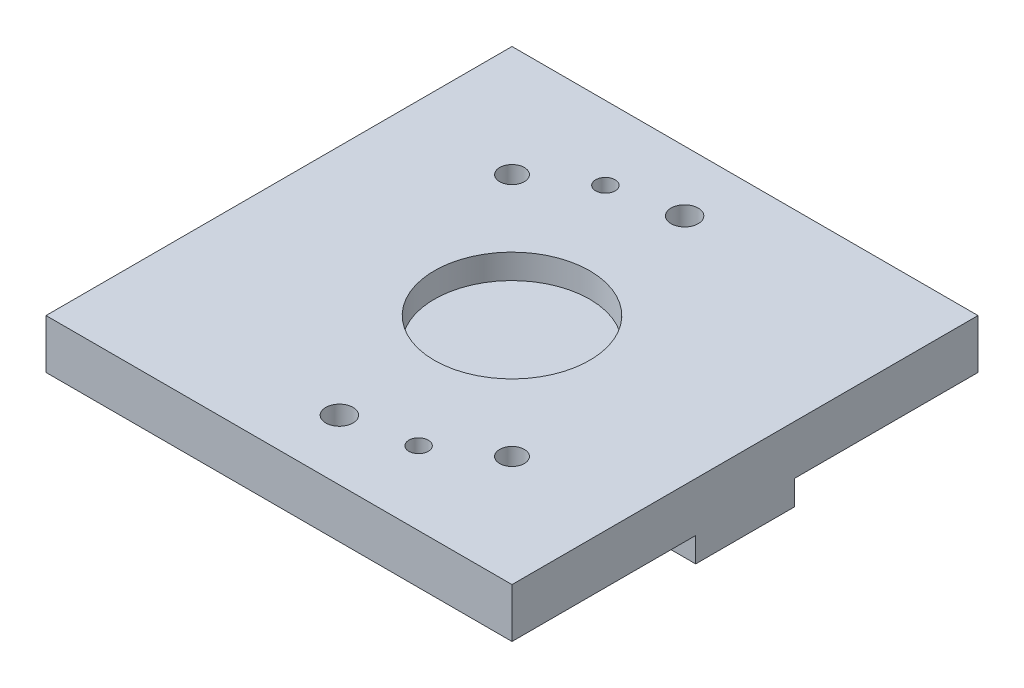
ISO-10303-21;
HEADER;
FILE_DESCRIPTION(('STEP AP214'),'2;1');
FILE_NAME('part.step','',(''),(''),'','','');
FILE_SCHEMA(('AUTOMOTIVE_DESIGN { 1 0 10303 214 1 1 1 1 }'));
ENDSEC;
DATA;
#1=APPLICATION_CONTEXT('core data for automotive mechanical design processes');
#2=APPLICATION_PROTOCOL_DEFINITION('international standard','automotive_design',2000,#1);
#3=PRODUCT_CONTEXT('',#1,'mechanical');
#4=PRODUCT('Part','Part','',(#3));
#5=PRODUCT_RELATED_PRODUCT_CATEGORY('part','',(#4));
#6=PRODUCT_DEFINITION_FORMATION('','',#4);
#7=PRODUCT_DEFINITION_CONTEXT('part definition',#1,'design');
#8=PRODUCT_DEFINITION('design','',#6,#7);
#9=PRODUCT_DEFINITION_SHAPE('','',#8);
#10=(LENGTH_UNIT() NAMED_UNIT(*) SI_UNIT(.MILLI.,.METRE.));
#11=(NAMED_UNIT(*) PLANE_ANGLE_UNIT() SI_UNIT($,.RADIAN.));
#12=(NAMED_UNIT(*) SI_UNIT($,.STERADIAN.) SOLID_ANGLE_UNIT());
#13=UNCERTAINTY_MEASURE_WITH_UNIT(LENGTH_MEASURE(1.E-05),#10,'distance_accuracy_value','');
#14=(GEOMETRIC_REPRESENTATION_CONTEXT(3) GLOBAL_UNCERTAINTY_ASSIGNED_CONTEXT((#13)) GLOBAL_UNIT_ASSIGNED_CONTEXT((#10,
#11,#12)) REPRESENTATION_CONTEXT('',''));
#15=CARTESIAN_POINT('',(0.,0.,0.));
#16=DIRECTION('',(0.,0.,1.));
#17=DIRECTION('',(1.,0.,0.));
#18=AXIS2_PLACEMENT_3D('',#15,#16,#17);
#19=CARTESIAN_POINT('',(0.,0.,0.));
#20=DIRECTION('',(0.,-1.,0.));
#21=DIRECTION('',(0.,0.,-1.));
#22=AXIS2_PLACEMENT_3D('',#19,#20,#21);
#23=PLANE('',#22);
#24=CARTESIAN_POINT('',(-17.0102785686281,0.,-41.066445220126));
#25=DIRECTION('',(0.,-1.,0.));
#26=DIRECTION('',(0.,0.,-1.));
#27=AXIS2_PLACEMENT_3D('',#24,#25,#26);
#28=CIRCLE('',#27,2.5);
#29=CARTESIAN_POINT('',(-17.0102785686281,0.,-43.566445220126));
#30=VERTEX_POINT('',#29);
#31=EDGE_CURVE('E205',#30,#30,#28,.T.);
#32=ORIENTED_EDGE('',*,*,#31,.F.);
#33=EDGE_LOOP('',(#32));
#34=FACE_BOUND('',#33,.T.);
#35=CARTESIAN_POINT('',(0.,0.,-44.45));
#36=DIRECTION('',(0.,-1.,0.));
#37=DIRECTION('',(0.,0.,-1.));
#38=AXIS2_PLACEMENT_3D('',#35,#36,#37);
#39=CIRCLE('',#38,3.5);
#40=CARTESIAN_POINT('',(0.,0.,-47.95));
#41=VERTEX_POINT('',#40);
#42=EDGE_CURVE('E193',#41,#41,#39,.T.);
#43=ORIENTED_EDGE('',*,*,#42,.F.);
#44=EDGE_LOOP('',(#43));
#45=FACE_BOUND('',#44,.T.);
#46=CARTESIAN_POINT('',(-31.4308964237415,0.,-31.4308964237407));
#47=DIRECTION('',(0.,-1.,0.));
#48=DIRECTION('',(0.,0.,-1.));
#49=AXIS2_PLACEMENT_3D('',#46,#47,#48);
#50=CIRCLE('',#49,3.17499999999999);
#51=CARTESIAN_POINT('',(-31.4308964237415,0.,-34.6058964237407));
#52=VERTEX_POINT('',#51);
#53=EDGE_CURVE('E181',#52,#52,#50,.T.);
#54=ORIENTED_EDGE('',*,*,#53,.F.);
#55=EDGE_LOOP('',(#54));
#56=FACE_BOUND('',#55,.T.);
#57=DIRECTION('',(1.,0.,0.));
#58=VECTOR('',#57,1.);
#59=CARTESIAN_POINT('',(-60.,0.,-12.7));
#60=LINE('',#59,#58);
#61=CARTESIAN_POINT('',(-60.,0.,-12.7));
#62=VERTEX_POINT('',#61);
#63=CARTESIAN_POINT('',(60.,0.,-12.7));
#64=VERTEX_POINT('',#63);
#65=EDGE_CURVE('E54',#62,#64,#60,.T.);
#66=ORIENTED_EDGE('',*,*,#65,.F.);
#67=DIRECTION('',(0.,0.,1.));
#68=VECTOR('',#67,1.);
#69=CARTESIAN_POINT('',(-60.,0.,60.));
#70=LINE('',#69,#68);
#71=CARTESIAN_POINT('',(-60.,0.,-60.));
#72=VERTEX_POINT('',#71);
#73=EDGE_CURVE('E148',#72,#62,#70,.T.);
#74=ORIENTED_EDGE('',*,*,#73,.F.);
#75=DIRECTION('',(-1.,0.,0.));
#76=VECTOR('',#75,1.);
#77=CARTESIAN_POINT('',(-60.,0.,-60.));
#78=LINE('',#77,#76);
#79=CARTESIAN_POINT('',(60.,0.,-60.));
#80=VERTEX_POINT('',#79);
#81=EDGE_CURVE('E145',#80,#72,#78,.T.);
#82=ORIENTED_EDGE('',*,*,#81,.F.);
#83=DIRECTION('',(0.,0.,-1.));
#84=VECTOR('',#83,1.);
#85=CARTESIAN_POINT('',(60.,0.,60.));
#86=LINE('',#85,#84);
#87=EDGE_CURVE('E59',#64,#80,#86,.T.);
#88=ORIENTED_EDGE('',*,*,#87,.F.);
#89=EDGE_LOOP('',(#66,#74,#82,#88));
#90=FACE_BOUND('',#89,.T.);
#91=ADVANCED_FACE('F39',(#34,#45,#56,#90),#23,.T.);
#92=CARTESIAN_POINT('',(60.,12.7,60.));
#93=DIRECTION('',(-1.,0.,0.));
#94=DIRECTION('',(0.,0.,1.));
#95=AXIS2_PLACEMENT_3D('',#92,#93,#94);
#96=PLANE('',#95);
#97=CARTESIAN_POINT('',(60.,0.,60.));
#98=VERTEX_POINT('',#97);
#99=CARTESIAN_POINT('',(60.,0.,12.7));
#100=VERTEX_POINT('',#99);
#101=EDGE_CURVE('E127',#98,#100,#86,.T.);
#102=ORIENTED_EDGE('',*,*,#101,.T.);
#103=DIRECTION('',(0.,1.,0.));
#104=VECTOR('',#103,1.);
#105=CARTESIAN_POINT('',(60.,-6.35,12.7));
#106=LINE('',#105,#104);
#107=CARTESIAN_POINT('',(60.,-6.35,12.7));
#108=VERTEX_POINT('',#107);
#109=EDGE_CURVE('E108',#108,#100,#106,.T.);
#110=ORIENTED_EDGE('',*,*,#109,.F.);
#111=DIRECTION('',(0.,0.,1.));
#112=VECTOR('',#111,1.);
#113=CARTESIAN_POINT('',(60.,-6.35,-12.7));
#114=LINE('',#113,#112);
#115=CARTESIAN_POINT('',(60.,-6.35,-12.7));
#116=VERTEX_POINT('',#115);
#117=EDGE_CURVE('E114',#116,#108,#114,.T.);
#118=ORIENTED_EDGE('',*,*,#117,.F.);
#119=DIRECTION('',(0.,1.,0.));
#120=VECTOR('',#119,1.);
#121=CARTESIAN_POINT('',(60.,-6.35,-12.7));
#122=LINE('',#121,#120);
#123=EDGE_CURVE('E166',#116,#64,#122,.T.);
#124=ORIENTED_EDGE('',*,*,#123,.T.);
#125=ORIENTED_EDGE('',*,*,#87,.T.);
#126=DIRECTION('',(0.,-1.,0.));
#127=VECTOR('',#126,1.);
#128=CARTESIAN_POINT('',(60.,12.7,-60.));
#129=LINE('',#128,#127);
#130=CARTESIAN_POINT('',(60.,12.7,-60.));
#131=VERTEX_POINT('',#130);
#132=EDGE_CURVE('E11',#131,#80,#129,.T.);
#133=ORIENTED_EDGE('',*,*,#132,.F.);
#134=DIRECTION('',(0.,0.,-1.));
#135=VECTOR('',#134,1.);
#136=CARTESIAN_POINT('',(60.,12.7,60.));
#137=LINE('',#136,#135);
#138=CARTESIAN_POINT('',(60.,12.7,60.));
#139=VERTEX_POINT('',#138);
#140=EDGE_CURVE('E134',#139,#131,#137,.T.);
#141=ORIENTED_EDGE('',*,*,#140,.F.);
#142=DIRECTION('',(0.,-1.,0.));
#143=VECTOR('',#142,1.);
#144=CARTESIAN_POINT('',(60.,12.7,60.));
#145=LINE('',#144,#143);
#146=EDGE_CURVE('E143',#139,#98,#145,.T.);
#147=ORIENTED_EDGE('',*,*,#146,.T.);
#148=EDGE_LOOP('',(#102,#110,#118,#124,#125,#133,#141,#147));
#149=FACE_BOUND('',#148,.T.);
#150=ADVANCED_FACE('F41',(#149),#96,.F.);
#151=CARTESIAN_POINT('',(-60.,12.7,-60.));
#152=DIRECTION('',(0.,0.,1.));
#153=DIRECTION('',(1.,0.,0.));
#154=AXIS2_PLACEMENT_3D('',#151,#152,#153);
#155=PLANE('',#154);
#156=ORIENTED_EDGE('',*,*,#81,.T.);
#157=DIRECTION('',(0.,-1.,0.));
#158=VECTOR('',#157,1.);
#159=CARTESIAN_POINT('',(-60.,12.7,-60.));
#160=LINE('',#159,#158);
#161=CARTESIAN_POINT('',(-60.,12.7,-60.));
#162=VERTEX_POINT('',#161);
#163=EDGE_CURVE('E47',#162,#72,#160,.T.);
#164=ORIENTED_EDGE('',*,*,#163,.F.);
#165=DIRECTION('',(-1.,0.,0.));
#166=VECTOR('',#165,1.);
#167=CARTESIAN_POINT('',(-60.,12.7,-60.));
#168=LINE('',#167,#166);
#169=EDGE_CURVE('E137',#131,#162,#168,.T.);
#170=ORIENTED_EDGE('',*,*,#169,.F.);
#171=ORIENTED_EDGE('',*,*,#132,.T.);
#172=EDGE_LOOP('',(#156,#164,#170,#171));
#173=FACE_BOUND('',#172,.T.);
#174=ADVANCED_FACE('F164',(#173),#155,.F.);
#175=CARTESIAN_POINT('',(-60.,12.7,60.));
#176=DIRECTION('',(1.,0.,0.));
#177=DIRECTION('',(0.,0.,-1.));
#178=AXIS2_PLACEMENT_3D('',#175,#176,#177);
#179=PLANE('',#178);
#180=ORIENTED_EDGE('',*,*,#73,.T.);
#181=DIRECTION('',(0.,1.,0.));
#182=VECTOR('',#181,1.);
#183=CARTESIAN_POINT('',(-60.,-6.35,-12.7));
#184=LINE('',#183,#182);
#185=CARTESIAN_POINT('',(-60.,-6.35,-12.7));
#186=VERTEX_POINT('',#185);
#187=EDGE_CURVE('E130',#186,#62,#184,.T.);
#188=ORIENTED_EDGE('',*,*,#187,.F.);
#189=DIRECTION('',(0.,0.,-1.));
#190=VECTOR('',#189,1.);
#191=CARTESIAN_POINT('',(-60.,-6.35,-12.7));
#192=LINE('',#191,#190);
#193=CARTESIAN_POINT('',(-60.,-6.35,12.7));
#194=VERTEX_POINT('',#193);
#195=EDGE_CURVE('E113',#194,#186,#192,.T.);
#196=ORIENTED_EDGE('',*,*,#195,.F.);
#197=DIRECTION('',(0.,1.,0.));
#198=VECTOR('',#197,1.);
#199=CARTESIAN_POINT('',(-60.,-6.35,12.7));
#200=LINE('',#199,#198);
#201=CARTESIAN_POINT('',(-60.,0.,12.7));
#202=VERTEX_POINT('',#201);
#203=EDGE_CURVE('E110',#194,#202,#200,.T.);
#204=ORIENTED_EDGE('',*,*,#203,.T.);
#205=CARTESIAN_POINT('',(-60.,0.,60.));
#206=VERTEX_POINT('',#205);
#207=EDGE_CURVE('E147',#202,#206,#70,.T.);
#208=ORIENTED_EDGE('',*,*,#207,.T.);
#209=DIRECTION('',(0.,-1.,0.));
#210=VECTOR('',#209,1.);
#211=CARTESIAN_POINT('',(-60.,12.7,60.));
#212=LINE('',#211,#210);
#213=CARTESIAN_POINT('',(-60.,12.7,60.));
#214=VERTEX_POINT('',#213);
#215=EDGE_CURVE('E152',#214,#206,#212,.T.);
#216=ORIENTED_EDGE('',*,*,#215,.F.);
#217=DIRECTION('',(0.,0.,1.));
#218=VECTOR('',#217,1.);
#219=CARTESIAN_POINT('',(-60.,12.7,60.));
#220=LINE('',#219,#218);
#221=EDGE_CURVE('E140',#162,#214,#220,.T.);
#222=ORIENTED_EDGE('',*,*,#221,.F.);
#223=ORIENTED_EDGE('',*,*,#163,.T.);
#224=EDGE_LOOP('',(#180,#188,#196,#204,#208,#216,#222,#223));
#225=FACE_BOUND('',#224,.T.);
#226=ADVANCED_FACE('F158',(#225),#179,.F.);
#227=CARTESIAN_POINT('',(-60.,12.7,60.));
#228=DIRECTION('',(0.,0.,-1.));
#229=DIRECTION('',(-1.,0.,0.));
#230=AXIS2_PLACEMENT_3D('',#227,#228,#229);
#231=PLANE('',#230);
#232=DIRECTION('',(1.,0.,0.));
#233=VECTOR('',#232,1.);
#234=CARTESIAN_POINT('',(-60.,0.,60.));
#235=LINE('',#234,#233);
#236=EDGE_CURVE('E138',#206,#98,#235,.T.);
#237=ORIENTED_EDGE('',*,*,#236,.T.);
#238=ORIENTED_EDGE('',*,*,#146,.F.);
#239=DIRECTION('',(1.,0.,0.));
#240=VECTOR('',#239,1.);
#241=CARTESIAN_POINT('',(-60.,12.7,60.));
#242=LINE('',#241,#240);
#243=EDGE_CURVE('E142',#214,#139,#242,.T.);
#244=ORIENTED_EDGE('',*,*,#243,.F.);
#245=ORIENTED_EDGE('',*,*,#215,.T.);
#246=EDGE_LOOP('',(#237,#238,#244,#245));
#247=FACE_BOUND('',#246,.T.);
#248=ADVANCED_FACE('F231',(#247),#231,.F.);
#249=CARTESIAN_POINT('',(0.,12.7,0.));
#250=DIRECTION('',(0.,-1.,0.));
#251=DIRECTION('',(0.,0.,-1.));
#252=AXIS2_PLACEMENT_3D('',#249,#250,#251);
#253=PLANE('',#252);
#254=CARTESIAN_POINT('',(0.,12.7,0.));
#255=DIRECTION('',(0.,1.,0.));
#256=DIRECTION('',(0.,0.,1.));
#257=AXIS2_PLACEMENT_3D('',#254,#255,#256);
#258=CIRCLE('',#257,20.);
#259=CARTESIAN_POINT('',(0.,12.7,20.));
#260=VERTEX_POINT('',#259);
#261=EDGE_CURVE('E212',#260,#260,#258,.T.);
#262=ORIENTED_EDGE('',*,*,#261,.F.);
#263=EDGE_LOOP('',(#262));
#264=FACE_BOUND('',#263,.T.);
#265=CARTESIAN_POINT('',(-17.0102785686281,12.7,-41.066445220126));
#266=DIRECTION('',(0.,1.,0.));
#267=DIRECTION('',(0.,0.,1.));
#268=AXIS2_PLACEMENT_3D('',#265,#266,#267);
#269=CIRCLE('',#268,2.5);
#270=CARTESIAN_POINT('',(-17.0102785686281,12.7,-38.566445220126));
#271=VERTEX_POINT('',#270);
#272=EDGE_CURVE('E208',#271,#271,#269,.T.);
#273=ORIENTED_EDGE('',*,*,#272,.F.);
#274=EDGE_LOOP('',(#273));
#275=FACE_BOUND('',#274,.T.);
#276=CARTESIAN_POINT('',(17.0102785686319,12.7,41.066445220126));
#277=DIRECTION('',(0.,1.,0.));
#278=DIRECTION('',(0.,0.,1.));
#279=AXIS2_PLACEMENT_3D('',#276,#277,#278);
#280=CIRCLE('',#279,2.5);
#281=CARTESIAN_POINT('',(17.0102785686319,12.7,43.566445220126));
#282=VERTEX_POINT('',#281);
#283=EDGE_CURVE('E202',#282,#282,#280,.T.);
#284=ORIENTED_EDGE('',*,*,#283,.F.);
#285=EDGE_LOOP('',(#284));
#286=FACE_BOUND('',#285,.T.);
#287=CARTESIAN_POINT('',(0.,12.7,-44.45));
#288=DIRECTION('',(0.,1.,0.));
#289=DIRECTION('',(0.,0.,1.));
#290=AXIS2_PLACEMENT_3D('',#287,#288,#289);
#291=CIRCLE('',#290,3.5);
#292=CARTESIAN_POINT('',(0.,12.7,-40.95));
#293=VERTEX_POINT('',#292);
#294=EDGE_CURVE('E196',#293,#293,#291,.T.);
#295=ORIENTED_EDGE('',*,*,#294,.F.);
#296=EDGE_LOOP('',(#295));
#297=FACE_BOUND('',#296,.T.);
#298=CARTESIAN_POINT('',(3.77914784249995E-12,12.7,44.45));
#299=DIRECTION('',(0.,1.,0.));
#300=DIRECTION('',(0.,0.,1.));
#301=AXIS2_PLACEMENT_3D('',#298,#299,#300);
#302=CIRCLE('',#301,3.5);
#303=CARTESIAN_POINT('',(3.77914784249995E-12,12.7,47.95));
#304=VERTEX_POINT('',#303);
#305=EDGE_CURVE('E190',#304,#304,#302,.T.);
#306=ORIENTED_EDGE('',*,*,#305,.F.);
#307=EDGE_LOOP('',(#306));
#308=FACE_BOUND('',#307,.T.);
#309=CARTESIAN_POINT('',(-31.4308964237415,12.7,-31.4308964237407));
#310=DIRECTION('',(0.,1.,0.));
#311=DIRECTION('',(0.,0.,1.));
#312=AXIS2_PLACEMENT_3D('',#309,#310,#311);
#313=CIRCLE('',#312,3.17499999999999);
#314=CARTESIAN_POINT('',(-31.4308964237415,12.7,-28.2558964237407));
#315=VERTEX_POINT('',#314);
#316=EDGE_CURVE('E184',#315,#315,#313,.T.);
#317=ORIENTED_EDGE('',*,*,#316,.F.);
#318=EDGE_LOOP('',(#317));
#319=FACE_BOUND('',#318,.T.);
#320=CARTESIAN_POINT('',(31.4308964237453,12.7,31.4308964237407));
#321=DIRECTION('',(0.,1.,0.));
#322=DIRECTION('',(0.,0.,1.));
#323=AXIS2_PLACEMENT_3D('',#320,#321,#322);
#324=CIRCLE('',#323,3.17499999999999);
#325=CARTESIAN_POINT('',(31.4308964237453,12.7,34.6058964237407));
#326=VERTEX_POINT('',#325);
#327=EDGE_CURVE('E178',#326,#326,#324,.T.);
#328=ORIENTED_EDGE('',*,*,#327,.F.);
#329=EDGE_LOOP('',(#328));
#330=FACE_BOUND('',#329,.T.);
#331=ORIENTED_EDGE('',*,*,#140,.T.);
#332=ORIENTED_EDGE('',*,*,#169,.T.);
#333=ORIENTED_EDGE('',*,*,#221,.T.);
#334=ORIENTED_EDGE('',*,*,#243,.T.);
#335=EDGE_LOOP('',(#331,#332,#333,#334));
#336=FACE_BOUND('',#335,.T.);
#337=ADVANCED_FACE('F227',(#264,#275,#286,#297,#308,#319,#330,#336),#253,.F.);
#338=CARTESIAN_POINT('',(17.0102785686319,0.,41.066445220126));
#339=DIRECTION('',(0.,-1.,0.));
#340=DIRECTION('',(0.,0.,-1.));
#341=AXIS2_PLACEMENT_3D('',#338,#339,#340);
#342=CIRCLE('',#341,2.5);
#343=CARTESIAN_POINT('',(17.0102785686319,0.,38.566445220126));
#344=VERTEX_POINT('',#343);
#345=EDGE_CURVE('E199',#344,#344,#342,.T.);
#346=ORIENTED_EDGE('',*,*,#345,.F.);
#347=EDGE_LOOP('',(#346));
#348=FACE_BOUND('',#347,.T.);
#349=CARTESIAN_POINT('',(3.77914784249995E-12,0.,44.45));
#350=DIRECTION('',(0.,-1.,0.));
#351=DIRECTION('',(0.,0.,-1.));
#352=AXIS2_PLACEMENT_3D('',#349,#350,#351);
#353=CIRCLE('',#352,3.5);
#354=CARTESIAN_POINT('',(3.77914784249995E-12,0.,40.95));
#355=VERTEX_POINT('',#354);
#356=EDGE_CURVE('E187',#355,#355,#353,.T.);
#357=ORIENTED_EDGE('',*,*,#356,.F.);
#358=EDGE_LOOP('',(#357));
#359=FACE_BOUND('',#358,.T.);
#360=CARTESIAN_POINT('',(31.4308964237453,0.,31.4308964237407));
#361=DIRECTION('',(0.,-1.,0.));
#362=DIRECTION('',(0.,0.,-1.));
#363=AXIS2_PLACEMENT_3D('',#360,#361,#362);
#364=CIRCLE('',#363,3.17499999999999);
#365=CARTESIAN_POINT('',(31.4308964237453,0.,28.2558964237407));
#366=VERTEX_POINT('',#365);
#367=EDGE_CURVE('E173',#366,#366,#364,.T.);
#368=ORIENTED_EDGE('',*,*,#367,.F.);
#369=EDGE_LOOP('',(#368));
#370=FACE_BOUND('',#369,.T.);
#371=DIRECTION('',(-1.,0.,0.));
#372=VECTOR('',#371,1.);
#373=CARTESIAN_POINT('',(-60.,0.,12.7));
#374=LINE('',#373,#372);
#375=EDGE_CURVE('E172',#100,#202,#374,.T.);
#376=ORIENTED_EDGE('',*,*,#375,.F.);
#377=ORIENTED_EDGE('',*,*,#101,.F.);
#378=ORIENTED_EDGE('',*,*,#236,.F.);
#379=ORIENTED_EDGE('',*,*,#207,.F.);
#380=EDGE_LOOP('',(#376,#377,#378,#379));
#381=FACE_BOUND('',#380,.T.);
#382=ADVANCED_FACE('F230',(#348,#359,#370,#381),#23,.T.);
#383=CARTESIAN_POINT('',(-60.,-6.35,12.7));
#384=DIRECTION('',(0.,0.,-1.));
#385=DIRECTION('',(-1.,0.,0.));
#386=AXIS2_PLACEMENT_3D('',#383,#384,#385);
#387=PLANE('',#386);
#388=ORIENTED_EDGE('',*,*,#375,.T.);
#389=ORIENTED_EDGE('',*,*,#203,.F.);
#390=DIRECTION('',(-1.,0.,0.));
#391=VECTOR('',#390,1.);
#392=CARTESIAN_POINT('',(-60.,-6.35,12.7));
#393=LINE('',#392,#391);
#394=EDGE_CURVE('E103',#108,#194,#393,.T.);
#395=ORIENTED_EDGE('',*,*,#394,.F.);
#396=ORIENTED_EDGE('',*,*,#109,.T.);
#397=EDGE_LOOP('',(#388,#389,#395,#396));
#398=FACE_BOUND('',#397,.T.);
#399=ADVANCED_FACE('F106',(#398),#387,.F.);
#400=CARTESIAN_POINT('',(-60.,-6.35,-12.7));
#401=DIRECTION('',(0.,0.,1.));
#402=DIRECTION('',(1.,0.,0.));
#403=AXIS2_PLACEMENT_3D('',#400,#401,#402);
#404=PLANE('',#403);
#405=ORIENTED_EDGE('',*,*,#65,.T.);
#406=ORIENTED_EDGE('',*,*,#123,.F.);
#407=DIRECTION('',(1.,0.,0.));
#408=VECTOR('',#407,1.);
#409=CARTESIAN_POINT('',(-60.,-6.35,-12.7));
#410=LINE('',#409,#408);
#411=EDGE_CURVE('E119',#186,#116,#410,.T.);
#412=ORIENTED_EDGE('',*,*,#411,.F.);
#413=ORIENTED_EDGE('',*,*,#187,.T.);
#414=EDGE_LOOP('',(#405,#406,#412,#413));
#415=FACE_BOUND('',#414,.T.);
#416=ADVANCED_FACE('F250',(#415),#404,.F.);
#417=CARTESIAN_POINT('',(0.,-6.35,0.));
#418=DIRECTION('',(0.,1.,0.));
#419=DIRECTION('',(0.,0.,1.));
#420=AXIS2_PLACEMENT_3D('',#417,#418,#419);
#421=PLANE('',#420);
#422=ORIENTED_EDGE('',*,*,#117,.T.);
#423=ORIENTED_EDGE('',*,*,#394,.T.);
#424=ORIENTED_EDGE('',*,*,#195,.T.);
#425=ORIENTED_EDGE('',*,*,#411,.T.);
#426=EDGE_LOOP('',(#422,#423,#424,#425));
#427=FACE_BOUND('',#426,.T.);
#428=ADVANCED_FACE('F117',(#427),#421,.F.);
#429=CARTESIAN_POINT('',(31.4308964237453,12.7,31.4308964237407));
#430=DIRECTION('',(0.,1.,0.));
#431=DIRECTION('',(0.,0.,1.));
#432=AXIS2_PLACEMENT_3D('',#429,#430,#431);
#433=CYLINDRICAL_SURFACE('',#432,3.17499999999999);
#434=ORIENTED_EDGE('',*,*,#367,.T.);
#435=EDGE_LOOP('',(#434));
#436=FACE_BOUND('',#435,.T.);
#437=ORIENTED_EDGE('',*,*,#327,.T.);
#438=EDGE_LOOP('',(#437));
#439=FACE_BOUND('',#438,.T.);
#440=ADVANCED_FACE('F257',(#436,#439),#433,.F.);
#441=CARTESIAN_POINT('',(-31.4308964237415,12.7,-31.4308964237407));
#442=DIRECTION('',(0.,1.,0.));
#443=DIRECTION('',(0.,0.,1.));
#444=AXIS2_PLACEMENT_3D('',#441,#442,#443);
#445=CYLINDRICAL_SURFACE('',#444,3.17499999999999);
#446=ORIENTED_EDGE('',*,*,#53,.T.);
#447=EDGE_LOOP('',(#446));
#448=FACE_BOUND('',#447,.T.);
#449=ORIENTED_EDGE('',*,*,#316,.T.);
#450=EDGE_LOOP('',(#449));
#451=FACE_BOUND('',#450,.T.);
#452=ADVANCED_FACE('F281',(#448,#451),#445,.F.);
#453=CARTESIAN_POINT('',(3.77914784249995E-12,12.7,44.45));
#454=DIRECTION('',(0.,1.,0.));
#455=DIRECTION('',(0.,0.,1.));
#456=AXIS2_PLACEMENT_3D('',#453,#454,#455);
#457=CYLINDRICAL_SURFACE('',#456,3.5);
#458=ORIENTED_EDGE('',*,*,#356,.T.);
#459=EDGE_LOOP('',(#458));
#460=FACE_BOUND('',#459,.T.);
#461=ORIENTED_EDGE('',*,*,#305,.T.);
#462=EDGE_LOOP('',(#461));
#463=FACE_BOUND('',#462,.T.);
#464=ADVANCED_FACE('F286',(#460,#463),#457,.F.);
#465=CARTESIAN_POINT('',(0.,12.7,-44.45));
#466=DIRECTION('',(0.,1.,0.));
#467=DIRECTION('',(0.,0.,1.));
#468=AXIS2_PLACEMENT_3D('',#465,#466,#467);
#469=CYLINDRICAL_SURFACE('',#468,3.5);
#470=ORIENTED_EDGE('',*,*,#42,.T.);
#471=EDGE_LOOP('',(#470));
#472=FACE_BOUND('',#471,.T.);
#473=ORIENTED_EDGE('',*,*,#294,.T.);
#474=EDGE_LOOP('',(#473));
#475=FACE_BOUND('',#474,.T.);
#476=ADVANCED_FACE('F292',(#472,#475),#469,.F.);
#477=CARTESIAN_POINT('',(17.0102785686319,12.7,41.066445220126));
#478=DIRECTION('',(0.,1.,0.));
#479=DIRECTION('',(0.,0.,1.));
#480=AXIS2_PLACEMENT_3D('',#477,#478,#479);
#481=CYLINDRICAL_SURFACE('',#480,2.5);
#482=ORIENTED_EDGE('',*,*,#345,.T.);
#483=EDGE_LOOP('',(#482));
#484=FACE_BOUND('',#483,.T.);
#485=ORIENTED_EDGE('',*,*,#283,.T.);
#486=EDGE_LOOP('',(#485));
#487=FACE_BOUND('',#486,.T.);
#488=ADVANCED_FACE('F296',(#484,#487),#481,.F.);
#489=CARTESIAN_POINT('',(-17.0102785686281,12.7,-41.066445220126));
#490=DIRECTION('',(0.,1.,0.));
#491=DIRECTION('',(0.,0.,1.));
#492=AXIS2_PLACEMENT_3D('',#489,#490,#491);
#493=CYLINDRICAL_SURFACE('',#492,2.5);
#494=ORIENTED_EDGE('',*,*,#31,.T.);
#495=EDGE_LOOP('',(#494));
#496=FACE_BOUND('',#495,.T.);
#497=ORIENTED_EDGE('',*,*,#272,.T.);
#498=EDGE_LOOP('',(#497));
#499=FACE_BOUND('',#498,.T.);
#500=ADVANCED_FACE('F223',(#496,#499),#493,.F.);
#501=CARTESIAN_POINT('',(0.,6.35,0.));
#502=DIRECTION('',(0.,1.,0.));
#503=DIRECTION('',(0.,0.,1.));
#504=AXIS2_PLACEMENT_3D('',#501,#502,#503);
#505=CYLINDRICAL_SURFACE('',#504,20.);
#506=CARTESIAN_POINT('',(0.,6.35,0.));
#507=DIRECTION('',(0.,1.,0.));
#508=DIRECTION('',(0.,0.,1.));
#509=AXIS2_PLACEMENT_3D('',#506,#507,#508);
#510=CIRCLE('',#509,20.);
#511=CARTESIAN_POINT('',(0.,6.35,20.));
#512=VERTEX_POINT('',#511);
#513=EDGE_CURVE('E211',#512,#512,#510,.T.);
#514=ORIENTED_EDGE('',*,*,#513,.F.);
#515=EDGE_LOOP('',(#514));
#516=FACE_BOUND('',#515,.T.);
#517=ORIENTED_EDGE('',*,*,#261,.T.);
#518=EDGE_LOOP('',(#517));
#519=FACE_BOUND('',#518,.T.);
#520=ADVANCED_FACE('F220',(#516,#519),#505,.F.);
#521=CARTESIAN_POINT('',(0.,6.35,0.));
#522=DIRECTION('',(0.,1.,0.));
#523=DIRECTION('',(0.,0.,1.));
#524=AXIS2_PLACEMENT_3D('',#521,#522,#523);
#525=PLANE('',#524);
#526=ORIENTED_EDGE('',*,*,#513,.T.);
#527=EDGE_LOOP('',(#526));
#528=FACE_BOUND('',#527,.T.);
#529=ADVANCED_FACE('F218',(#528),#525,.T.);
#530=CLOSED_SHELL('',(#91,#150,#174,#226,#248,#337,#382,#399,#416,#428,#440,#452,#464,#476,#488,
#500,#520,#529));
#531=MANIFOLD_SOLID_BREP('B2',#530);
#532=ADVANCED_BREP_SHAPE_REPRESENTATION('',(#18,#531),#14);
#533=SHAPE_DEFINITION_REPRESENTATION(#9,#532);
ENDSEC;
END-ISO-10303-21;
